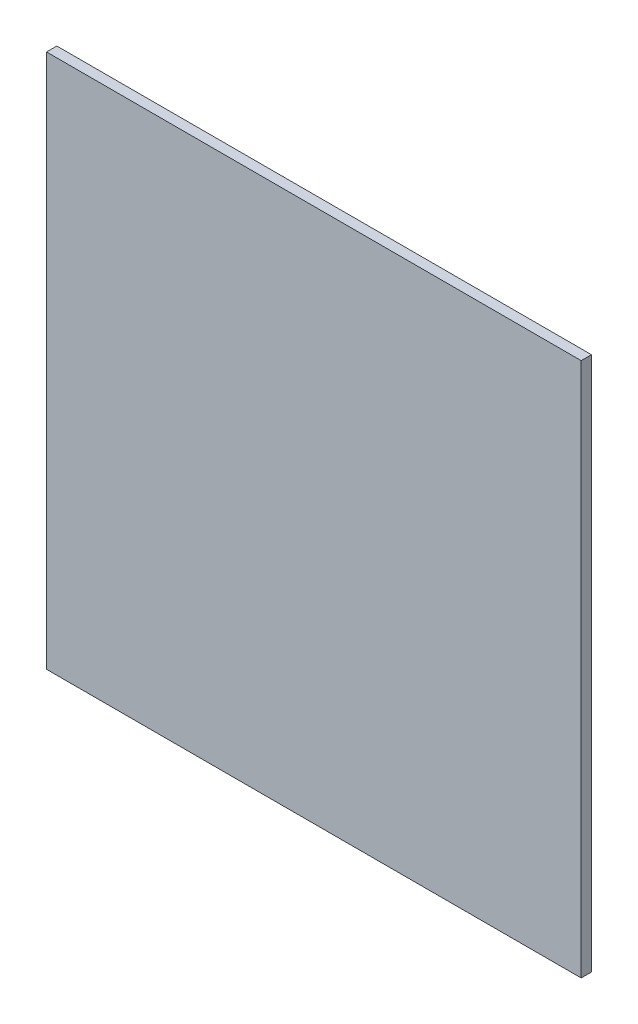
ISO-10303-21;
HEADER;
FILE_DESCRIPTION(('STEP AP214'),'2;1');
FILE_NAME('part.step','',(''),(''),'','','');
FILE_SCHEMA(('AUTOMOTIVE_DESIGN { 1 0 10303 214 1 1 1 1 }'));
ENDSEC;
DATA;
#1=APPLICATION_CONTEXT('core data for automotive mechanical design processes');
#2=APPLICATION_PROTOCOL_DEFINITION('international standard','automotive_design',2000,#1);
#3=PRODUCT_CONTEXT('',#1,'mechanical');
#4=PRODUCT('Part','Part','',(#3));
#5=PRODUCT_RELATED_PRODUCT_CATEGORY('part','',(#4));
#6=PRODUCT_DEFINITION_FORMATION('','',#4);
#7=PRODUCT_DEFINITION_CONTEXT('part definition',#1,'design');
#8=PRODUCT_DEFINITION('design','',#6,#7);
#9=PRODUCT_DEFINITION_SHAPE('','',#8);
#10=(LENGTH_UNIT() NAMED_UNIT(*) SI_UNIT(.MILLI.,.METRE.));
#11=(NAMED_UNIT(*) PLANE_ANGLE_UNIT() SI_UNIT($,.RADIAN.));
#12=(NAMED_UNIT(*) SI_UNIT($,.STERADIAN.) SOLID_ANGLE_UNIT());
#13=UNCERTAINTY_MEASURE_WITH_UNIT(LENGTH_MEASURE(1.E-05),#10,'distance_accuracy_value','');
#14=(GEOMETRIC_REPRESENTATION_CONTEXT(3) GLOBAL_UNCERTAINTY_ASSIGNED_CONTEXT((#13)) GLOBAL_UNIT_ASSIGNED_CONTEXT((#10,
#11,#12)) REPRESENTATION_CONTEXT('',''));
#15=CARTESIAN_POINT('',(0.,0.,0.));
#16=DIRECTION('',(0.,0.,1.));
#17=DIRECTION('',(1.,0.,0.));
#18=AXIS2_PLACEMENT_3D('',#15,#16,#17);
#19=CARTESIAN_POINT('',(0.,0.,10.));
#20=DIRECTION('',(1.,0.,0.));
#21=DIRECTION('',(0.,0.,-1.));
#22=AXIS2_PLACEMENT_3D('',#19,#20,#21);
#23=PLANE('',#22);
#24=DIRECTION('',(0.,-1.,0.));
#25=VECTOR('',#24,1.);
#26=CARTESIAN_POINT('',(0.,0.,0.));
#27=LINE('',#26,#25);
#28=CARTESIAN_POINT('',(0.,520.,0.));
#29=VERTEX_POINT('',#28);
#30=CARTESIAN_POINT('',(0.,0.,0.));
#31=VERTEX_POINT('',#30);
#32=EDGE_CURVE('E96',#29,#31,#27,.T.);
#33=ORIENTED_EDGE('',*,*,#32,.T.);
#34=DIRECTION('',(0.,0.,-1.));
#35=VECTOR('',#34,1.);
#36=CARTESIAN_POINT('',(0.,0.,10.));
#37=LINE('',#36,#35);
#38=CARTESIAN_POINT('',(0.,0.,10.));
#39=VERTEX_POINT('',#38);
#40=EDGE_CURVE('E11',#39,#31,#37,.T.);
#41=ORIENTED_EDGE('',*,*,#40,.F.);
#42=DIRECTION('',(0.,-1.,0.));
#43=VECTOR('',#42,1.);
#44=CARTESIAN_POINT('',(0.,0.,10.));
#45=LINE('',#44,#43);
#46=CARTESIAN_POINT('',(0.,520.,10.));
#47=VERTEX_POINT('',#46);
#48=EDGE_CURVE('E84',#47,#39,#45,.T.);
#49=ORIENTED_EDGE('',*,*,#48,.F.);
#50=DIRECTION('',(0.,0.,-1.));
#51=VECTOR('',#50,1.);
#52=CARTESIAN_POINT('',(0.,520.,10.));
#53=LINE('',#52,#51);
#54=EDGE_CURVE('E92',#47,#29,#53,.T.);
#55=ORIENTED_EDGE('',*,*,#54,.T.);
#56=EDGE_LOOP('',(#33,#41,#49,#55));
#57=FACE_BOUND('',#56,.T.);
#58=ADVANCED_FACE('F33',(#57),#23,.F.);
#59=CARTESIAN_POINT('',(0.,0.,10.));
#60=DIRECTION('',(0.,1.,0.));
#61=DIRECTION('',(0.,0.,1.));
#62=AXIS2_PLACEMENT_3D('',#59,#60,#61);
#63=PLANE('',#62);
#64=DIRECTION('',(1.,0.,0.));
#65=VECTOR('',#64,1.);
#66=CARTESIAN_POINT('',(0.,0.,0.));
#67=LINE('',#66,#65);
#68=CARTESIAN_POINT('',(520.,0.,0.));
#69=VERTEX_POINT('',#68);
#70=EDGE_CURVE('E88',#31,#69,#67,.T.);
#71=ORIENTED_EDGE('',*,*,#70,.T.);
#72=DIRECTION('',(0.,0.,-1.));
#73=VECTOR('',#72,1.);
#74=CARTESIAN_POINT('',(520.,0.,10.));
#75=LINE('',#74,#73);
#76=CARTESIAN_POINT('',(520.,0.,10.));
#77=VERTEX_POINT('',#76);
#78=EDGE_CURVE('E41',#77,#69,#75,.T.);
#79=ORIENTED_EDGE('',*,*,#78,.F.);
#80=DIRECTION('',(1.,0.,0.));
#81=VECTOR('',#80,1.);
#82=CARTESIAN_POINT('',(0.,0.,10.));
#83=LINE('',#82,#81);
#84=EDGE_CURVE('E79',#39,#77,#83,.T.);
#85=ORIENTED_EDGE('',*,*,#84,.F.);
#86=ORIENTED_EDGE('',*,*,#40,.T.);
#87=EDGE_LOOP('',(#71,#79,#85,#86));
#88=FACE_BOUND('',#87,.T.);
#89=ADVANCED_FACE('F87',(#88),#63,.F.);
#90=CARTESIAN_POINT('',(520.,0.,10.));
#91=DIRECTION('',(-1.,0.,0.));
#92=DIRECTION('',(0.,0.,1.));
#93=AXIS2_PLACEMENT_3D('',#90,#91,#92);
#94=PLANE('',#93);
#95=DIRECTION('',(0.,1.,0.));
#96=VECTOR('',#95,1.);
#97=CARTESIAN_POINT('',(520.,0.,0.));
#98=LINE('',#97,#96);
#99=CARTESIAN_POINT('',(520.,520.,0.));
#100=VERTEX_POINT('',#99);
#101=EDGE_CURVE('E66',#69,#100,#98,.T.);
#102=ORIENTED_EDGE('',*,*,#101,.T.);
#103=DIRECTION('',(0.,0.,-1.));
#104=VECTOR('',#103,1.);
#105=CARTESIAN_POINT('',(520.,520.,10.));
#106=LINE('',#105,#104);
#107=CARTESIAN_POINT('',(520.,520.,10.));
#108=VERTEX_POINT('',#107);
#109=EDGE_CURVE('E89',#108,#100,#106,.T.);
#110=ORIENTED_EDGE('',*,*,#109,.F.);
#111=DIRECTION('',(0.,1.,0.));
#112=VECTOR('',#111,1.);
#113=CARTESIAN_POINT('',(520.,0.,10.));
#114=LINE('',#113,#112);
#115=EDGE_CURVE('E82',#77,#108,#114,.T.);
#116=ORIENTED_EDGE('',*,*,#115,.F.);
#117=ORIENTED_EDGE('',*,*,#78,.T.);
#118=EDGE_LOOP('',(#102,#110,#116,#117));
#119=FACE_BOUND('',#118,.T.);
#120=ADVANCED_FACE('F90',(#119),#94,.F.);
#121=CARTESIAN_POINT('',(0.,520.,10.));
#122=DIRECTION('',(0.,-1.,0.));
#123=DIRECTION('',(0.,0.,-1.));
#124=AXIS2_PLACEMENT_3D('',#121,#122,#123);
#125=PLANE('',#124);
#126=DIRECTION('',(-1.,0.,0.));
#127=VECTOR('',#126,1.);
#128=CARTESIAN_POINT('',(0.,520.,0.));
#129=LINE('',#128,#127);
#130=EDGE_CURVE('E72',#100,#29,#129,.T.);
#131=ORIENTED_EDGE('',*,*,#130,.T.);
#132=ORIENTED_EDGE('',*,*,#54,.F.);
#133=DIRECTION('',(-1.,0.,0.));
#134=VECTOR('',#133,1.);
#135=CARTESIAN_POINT('',(0.,520.,10.));
#136=LINE('',#135,#134);
#137=EDGE_CURVE('E49',#108,#47,#136,.T.);
#138=ORIENTED_EDGE('',*,*,#137,.F.);
#139=ORIENTED_EDGE('',*,*,#109,.T.);
#140=EDGE_LOOP('',(#131,#132,#138,#139));
#141=FACE_BOUND('',#140,.T.);
#142=ADVANCED_FACE('F103',(#141),#125,.F.);
#143=CARTESIAN_POINT('',(0.,0.,10.));
#144=DIRECTION('',(0.,0.,-1.));
#145=DIRECTION('',(-1.,0.,0.));
#146=AXIS2_PLACEMENT_3D('',#143,#144,#145);
#147=PLANE('',#146);
#148=ORIENTED_EDGE('',*,*,#48,.T.);
#149=ORIENTED_EDGE('',*,*,#84,.T.);
#150=ORIENTED_EDGE('',*,*,#115,.T.);
#151=ORIENTED_EDGE('',*,*,#137,.T.);
#152=EDGE_LOOP('',(#148,#149,#150,#151));
#153=FACE_BOUND('',#152,.T.);
#154=ADVANCED_FACE('F80',(#153),#147,.F.);
#155=CARTESIAN_POINT('',(0.,0.,0.));
#156=DIRECTION('',(0.,0.,-1.));
#157=DIRECTION('',(-1.,0.,0.));
#158=AXIS2_PLACEMENT_3D('',#155,#156,#157);
#159=PLANE('',#158);
#160=ORIENTED_EDGE('',*,*,#32,.F.);
#161=ORIENTED_EDGE('',*,*,#130,.F.);
#162=ORIENTED_EDGE('',*,*,#101,.F.);
#163=ORIENTED_EDGE('',*,*,#70,.F.);
#164=EDGE_LOOP('',(#160,#161,#162,#163));
#165=FACE_BOUND('',#164,.T.);
#166=ADVANCED_FACE('F106',(#165),#159,.T.);
#167=CLOSED_SHELL('',(#58,#89,#120,#142,#154,#166));
#168=MANIFOLD_SOLID_BREP('B2',#167);
#169=ADVANCED_BREP_SHAPE_REPRESENTATION('',(#18,#168),#14);
#170=SHAPE_DEFINITION_REPRESENTATION(#9,#169);
ENDSEC;
END-ISO-10303-21;
